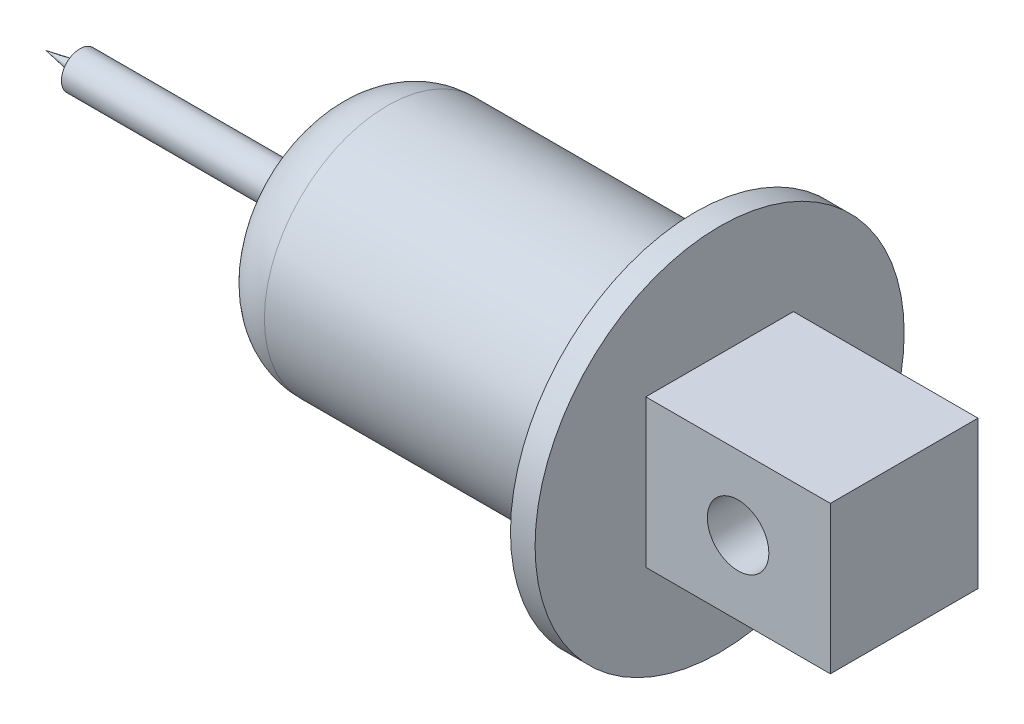
ISO-10303-21;
HEADER;
FILE_DESCRIPTION(('STEP AP214'),'2;1');
FILE_NAME('part.step','',(''),(''),'','','');
FILE_SCHEMA(('AUTOMOTIVE_DESIGN { 1 0 10303 214 1 1 1 1 }'));
ENDSEC;
DATA;
#1=APPLICATION_CONTEXT('core data for automotive mechanical design processes');
#2=APPLICATION_PROTOCOL_DEFINITION('international standard','automotive_design',2000,#1);
#3=PRODUCT_CONTEXT('',#1,'mechanical');
#4=PRODUCT('Part','Part','',(#3));
#5=PRODUCT_RELATED_PRODUCT_CATEGORY('part','',(#4));
#6=PRODUCT_DEFINITION_FORMATION('','',#4);
#7=PRODUCT_DEFINITION_CONTEXT('part definition',#1,'design');
#8=PRODUCT_DEFINITION('design','',#6,#7);
#9=PRODUCT_DEFINITION_SHAPE('','',#8);
#10=(LENGTH_UNIT() NAMED_UNIT(*) SI_UNIT(.MILLI.,.METRE.));
#11=(NAMED_UNIT(*) PLANE_ANGLE_UNIT() SI_UNIT($,.RADIAN.));
#12=(NAMED_UNIT(*) SI_UNIT($,.STERADIAN.) SOLID_ANGLE_UNIT());
#13=UNCERTAINTY_MEASURE_WITH_UNIT(LENGTH_MEASURE(1.E-05),#10,'distance_accuracy_value','');
#14=(GEOMETRIC_REPRESENTATION_CONTEXT(3) GLOBAL_UNCERTAINTY_ASSIGNED_CONTEXT((#13)) GLOBAL_UNIT_ASSIGNED_CONTEXT((#10,
#11,#12)) REPRESENTATION_CONTEXT('',''));
#15=CARTESIAN_POINT('',(0.,0.,0.));
#16=DIRECTION('',(0.,0.,1.));
#17=DIRECTION('',(1.,0.,0.));
#18=AXIS2_PLACEMENT_3D('',#15,#16,#17);
#19=CARTESIAN_POINT('',(0.,0.,0.));
#20=DIRECTION('',(-1.,0.,0.));
#21=DIRECTION('',(0.,0.,1.));
#22=AXIS2_PLACEMENT_3D('',#19,#20,#21);
#23=PLANE('',#22);
#24=CARTESIAN_POINT('',(0.,0.,0.));
#25=DIRECTION('',(-1.,0.,0.));
#26=DIRECTION('',(0.,0.,1.));
#27=AXIS2_PLACEMENT_3D('',#24,#25,#26);
#28=CIRCLE('',#27,1.5);
#29=CARTESIAN_POINT('',(0.,0.,1.5));
#30=VERTEX_POINT('',#29);
#31=EDGE_CURVE('E262',#30,#30,#28,.T.);
#32=ORIENTED_EDGE('',*,*,#31,.T.);
#33=EDGE_LOOP('',(#32));
#34=FACE_BOUND('',#33,.T.);
#35=CARTESIAN_POINT('',(0.,0.,0.));
#36=DIRECTION('',(-1.,0.,0.));
#37=DIRECTION('',(0.,0.,1.));
#38=AXIS2_PLACEMENT_3D('',#35,#36,#37);
#39=CIRCLE('',#38,0.5);
#40=CARTESIAN_POINT('',(0.,0.,0.5));
#41=VERTEX_POINT('',#40);
#42=EDGE_CURVE('E263',#41,#41,#39,.T.);
#43=ORIENTED_EDGE('',*,*,#42,.F.);
#44=EDGE_LOOP('',(#43));
#45=FACE_BOUND('',#44,.T.);
#46=ADVANCED_FACE('F35',(#34,#45),#23,.T.);
#47=CARTESIAN_POINT('',(20.,0.,0.));
#48=DIRECTION('',(-1.,0.,0.));
#49=DIRECTION('',(0.,0.,1.));
#50=AXIS2_PLACEMENT_3D('',#47,#48,#49);
#51=PLANE('',#50);
#52=CARTESIAN_POINT('',(20.,0.,0.));
#53=DIRECTION('',(-1.,0.,0.));
#54=DIRECTION('',(0.,0.,1.));
#55=AXIS2_PLACEMENT_3D('',#52,#53,#54);
#56=CIRCLE('',#55,5.);
#57=CARTESIAN_POINT('',(20.,0.,4.99999999999993));
#58=VERTEX_POINT('',#57);
#59=EDGE_CURVE('E43',#58,#58,#56,.T.);
#60=ORIENTED_EDGE('',*,*,#59,.T.);
#61=EDGE_LOOP('',(#60));
#62=FACE_BOUND('',#61,.T.);
#63=CARTESIAN_POINT('',(20.,0.,0.));
#64=DIRECTION('',(-1.,0.,0.));
#65=DIRECTION('',(0.,0.,1.));
#66=AXIS2_PLACEMENT_3D('',#63,#64,#65);
#67=CIRCLE('',#66,1.5);
#68=CARTESIAN_POINT('',(20.,0.,1.49999999999993));
#69=VERTEX_POINT('',#68);
#70=EDGE_CURVE('E260',#69,#69,#67,.T.);
#71=ORIENTED_EDGE('',*,*,#70,.F.);
#72=EDGE_LOOP('',(#71));
#73=FACE_BOUND('',#72,.T.);
#74=ADVANCED_FACE('F97',(#62,#73),#51,.T.);
#75=CARTESIAN_POINT('',(50.,0.,-1.74574066942157E-13));
#76=DIRECTION('',(1.,0.,0.));
#77=DIRECTION('',(0.,0.,-1.));
#78=AXIS2_PLACEMENT_3D('',#75,#76,#77);
#79=PLANE('',#78);
#80=CARTESIAN_POINT('',(50.,0.,-1.74574066942157E-13));
#81=DIRECTION('',(1.,0.,0.));
#82=DIRECTION('',(0.,0.,-1.));
#83=AXIS2_PLACEMENT_3D('',#80,#81,#82);
#84=CIRCLE('',#83,15.);
#85=CARTESIAN_POINT('',(50.,0.,-15.0000000000002));
#86=VERTEX_POINT('',#85);
#87=EDGE_CURVE('E147',#86,#86,#84,.T.);
#88=ORIENTED_EDGE('',*,*,#87,.F.);
#89=EDGE_LOOP('',(#88));
#90=FACE_BOUND('',#89,.T.);
#91=CARTESIAN_POINT('',(50.,0.,-1.74574066942157E-13));
#92=DIRECTION('',(1.,0.,0.));
#93=DIRECTION('',(0.,0.,-1.));
#94=AXIS2_PLACEMENT_3D('',#91,#92,#93);
#95=CIRCLE('',#94,10.);
#96=CARTESIAN_POINT('',(50.,0.,-10.0000000000002));
#97=VERTEX_POINT('',#96);
#98=EDGE_CURVE('E153',#97,#97,#95,.F.);
#99=ORIENTED_EDGE('',*,*,#98,.F.);
#100=EDGE_LOOP('',(#99));
#101=FACE_BOUND('',#100,.T.);
#102=ADVANCED_FACE('F102',(#90,#101),#79,.F.);
#103=CARTESIAN_POINT('',(52.,0.,-1.81557029619843E-13));
#104=DIRECTION('',(1.,0.,0.));
#105=DIRECTION('',(0.,0.,-1.));
#106=AXIS2_PLACEMENT_3D('',#103,#104,#105);
#107=PLANE('',#106);
#108=CARTESIAN_POINT('',(52.,0.,-1.81557029619843E-13));
#109=DIRECTION('',(1.,0.,0.));
#110=DIRECTION('',(0.,0.,-1.));
#111=AXIS2_PLACEMENT_3D('',#108,#109,#110);
#112=CIRCLE('',#111,15.);
#113=CARTESIAN_POINT('',(52.,0.,-15.0000000000002));
#114=VERTEX_POINT('',#113);
#115=EDGE_CURVE('E150',#114,#114,#112,.T.);
#116=ORIENTED_EDGE('',*,*,#115,.T.);
#117=EDGE_LOOP('',(#116));
#118=FACE_BOUND('',#117,.T.);
#119=DIRECTION('',(0.,0.,1.));
#120=VECTOR('',#119,1.);
#121=CARTESIAN_POINT('',(52.,6.,5.99999999999982));
#122=LINE('',#121,#120);
#123=CARTESIAN_POINT('',(52.,6.,-6.00000000000018));
#124=VERTEX_POINT('',#123);
#125=CARTESIAN_POINT('',(52.,6.,5.99999999999982));
#126=VERTEX_POINT('',#125);
#127=EDGE_CURVE('E279',#124,#126,#122,.T.);
#128=ORIENTED_EDGE('',*,*,#127,.F.);
#129=DIRECTION('',(0.,1.,0.));
#130=VECTOR('',#129,1.);
#131=CARTESIAN_POINT('',(52.,6.,-6.00000000000018));
#132=LINE('',#131,#130);
#133=CARTESIAN_POINT('',(52.,-6.,-6.00000000000018));
#134=VERTEX_POINT('',#133);
#135=EDGE_CURVE('E161',#134,#124,#132,.T.);
#136=ORIENTED_EDGE('',*,*,#135,.F.);
#137=DIRECTION('',(0.,0.,-1.));
#138=VECTOR('',#137,1.);
#139=CARTESIAN_POINT('',(52.,-6.,5.99999999999982));
#140=LINE('',#139,#138);
#141=CARTESIAN_POINT('',(52.,-6.,5.99999999999982));
#142=VERTEX_POINT('',#141);
#143=EDGE_CURVE('E73',#142,#134,#140,.T.);
#144=ORIENTED_EDGE('',*,*,#143,.F.);
#145=DIRECTION('',(0.,-1.,0.));
#146=VECTOR('',#145,1.);
#147=CARTESIAN_POINT('',(52.,6.,5.99999999999982));
#148=LINE('',#147,#146);
#149=EDGE_CURVE('E281',#126,#142,#148,.T.);
#150=ORIENTED_EDGE('',*,*,#149,.F.);
#151=EDGE_LOOP('',(#128,#136,#144,#150));
#152=FACE_BOUND('',#151,.T.);
#153=ADVANCED_FACE('F136',(#118,#152),#107,.T.);
#154=CARTESIAN_POINT('',(50.,0.,-1.74574066942157E-13));
#155=DIRECTION('',(1.,0.,0.));
#156=DIRECTION('',(0.,0.,-1.));
#157=AXIS2_PLACEMENT_3D('',#154,#155,#156);
#158=CYLINDRICAL_SURFACE('',#157,15.);
#159=ORIENTED_EDGE('',*,*,#87,.T.);
#160=EDGE_LOOP('',(#159));
#161=FACE_BOUND('',#160,.T.);
#162=ORIENTED_EDGE('',*,*,#115,.F.);
#163=EDGE_LOOP('',(#162));
#164=FACE_BOUND('',#163,.T.);
#165=ADVANCED_FACE('F132',(#161,#164),#158,.T.);
#166=CARTESIAN_POINT('',(67.,6.,-6.00000000000023));
#167=DIRECTION('',(0.,0.,1.));
#168=DIRECTION('',(0.,-1.,0.));
#169=AXIS2_PLACEMENT_3D('',#166,#167,#168);
#170=PLANE('',#169);
#171=CARTESIAN_POINT('',(59.5,0.,-6.00000000000021));
#172=DIRECTION('',(0.,0.,-1.));
#173=DIRECTION('',(0.,1.,0.));
#174=AXIS2_PLACEMENT_3D('',#171,#172,#173);
#175=CIRCLE('',#174,2.5);
#176=CARTESIAN_POINT('',(59.5,2.5,-6.00000000000021));
#177=VERTEX_POINT('',#176);
#178=EDGE_CURVE('E162',#177,#177,#175,.T.);
#179=ORIENTED_EDGE('',*,*,#178,.F.);
#180=EDGE_LOOP('',(#179));
#181=FACE_BOUND('',#180,.T.);
#182=ORIENTED_EDGE('',*,*,#135,.T.);
#183=DIRECTION('',(-1.,0.,0.));
#184=VECTOR('',#183,1.);
#185=CARTESIAN_POINT('',(67.,6.,-6.00000000000023));
#186=LINE('',#185,#184);
#187=CARTESIAN_POINT('',(67.,6.,-6.00000000000023));
#188=VERTEX_POINT('',#187);
#189=EDGE_CURVE('E151',#188,#124,#186,.T.);
#190=ORIENTED_EDGE('',*,*,#189,.F.);
#191=DIRECTION('',(0.,1.,0.));
#192=VECTOR('',#191,1.);
#193=CARTESIAN_POINT('',(67.,6.,-6.00000000000023));
#194=LINE('',#193,#192);
#195=CARTESIAN_POINT('',(67.,-6.,-6.00000000000024));
#196=VERTEX_POINT('',#195);
#197=EDGE_CURVE('E270',#196,#188,#194,.T.);
#198=ORIENTED_EDGE('',*,*,#197,.F.);
#199=DIRECTION('',(-1.,0.,0.));
#200=VECTOR('',#199,1.);
#201=CARTESIAN_POINT('',(67.,-6.,-6.00000000000024));
#202=LINE('',#201,#200);
#203=EDGE_CURVE('E276',#196,#134,#202,.T.);
#204=ORIENTED_EDGE('',*,*,#203,.T.);
#205=EDGE_LOOP('',(#182,#190,#198,#204));
#206=FACE_BOUND('',#205,.T.);
#207=ADVANCED_FACE('F129',(#181,#206),#170,.F.);
#208=CARTESIAN_POINT('',(67.,6.,5.99999999999977));
#209=DIRECTION('',(0.,-1.,0.));
#210=DIRECTION('',(-1.,0.,0.));
#211=AXIS2_PLACEMENT_3D('',#208,#209,#210);
#212=PLANE('',#211);
#213=ORIENTED_EDGE('',*,*,#127,.T.);
#214=DIRECTION('',(-1.,0.,0.));
#215=VECTOR('',#214,1.);
#216=CARTESIAN_POINT('',(67.,6.,5.99999999999977));
#217=LINE('',#216,#215);
#218=CARTESIAN_POINT('',(67.,6.,5.99999999999977));
#219=VERTEX_POINT('',#218);
#220=EDGE_CURVE('E155',#219,#126,#217,.T.);
#221=ORIENTED_EDGE('',*,*,#220,.F.);
#222=DIRECTION('',(0.,0.,1.));
#223=VECTOR('',#222,1.);
#224=CARTESIAN_POINT('',(67.,6.,5.99999999999977));
#225=LINE('',#224,#223);
#226=EDGE_CURVE('E80',#188,#219,#225,.T.);
#227=ORIENTED_EDGE('',*,*,#226,.F.);
#228=ORIENTED_EDGE('',*,*,#189,.T.);
#229=EDGE_LOOP('',(#213,#221,#227,#228));
#230=FACE_BOUND('',#229,.T.);
#231=ADVANCED_FACE('F125',(#230),#212,.F.);
#232=CARTESIAN_POINT('',(67.,6.,5.99999999999977));
#233=DIRECTION('',(0.,0.,-1.));
#234=DIRECTION('',(0.,1.,0.));
#235=AXIS2_PLACEMENT_3D('',#232,#233,#234);
#236=PLANE('',#235);
#237=CARTESIAN_POINT('',(59.5,0.,5.99999999999979));
#238=DIRECTION('',(0.,0.,-1.));
#239=DIRECTION('',(0.,1.,0.));
#240=AXIS2_PLACEMENT_3D('',#237,#238,#239);
#241=CIRCLE('',#240,2.5);
#242=CARTESIAN_POINT('',(59.5,2.5,5.99999999999979));
#243=VERTEX_POINT('',#242);
#244=EDGE_CURVE('E158',#243,#243,#241,.T.);
#245=ORIENTED_EDGE('',*,*,#244,.T.);
#246=EDGE_LOOP('',(#245));
#247=FACE_BOUND('',#246,.T.);
#248=ORIENTED_EDGE('',*,*,#149,.T.);
#249=DIRECTION('',(-1.,0.,0.));
#250=VECTOR('',#249,1.);
#251=CARTESIAN_POINT('',(67.,-6.,5.99999999999976));
#252=LINE('',#251,#250);
#253=CARTESIAN_POINT('',(67.,-6.,5.99999999999976));
#254=VERTEX_POINT('',#253);
#255=EDGE_CURVE('E50',#254,#142,#252,.T.);
#256=ORIENTED_EDGE('',*,*,#255,.F.);
#257=DIRECTION('',(0.,-1.,0.));
#258=VECTOR('',#257,1.);
#259=CARTESIAN_POINT('',(67.,6.,5.99999999999977));
#260=LINE('',#259,#258);
#261=EDGE_CURVE('E273',#219,#254,#260,.T.);
#262=ORIENTED_EDGE('',*,*,#261,.F.);
#263=ORIENTED_EDGE('',*,*,#220,.T.);
#264=EDGE_LOOP('',(#248,#256,#262,#263));
#265=FACE_BOUND('',#264,.T.);
#266=ADVANCED_FACE('F122',(#247,#265),#236,.F.);
#267=CARTESIAN_POINT('',(67.,-6.,5.99999999999976));
#268=DIRECTION('',(0.,1.,0.));
#269=DIRECTION('',(1.,0.,0.));
#270=AXIS2_PLACEMENT_3D('',#267,#268,#269);
#271=PLANE('',#270);
#272=ORIENTED_EDGE('',*,*,#143,.T.);
#273=ORIENTED_EDGE('',*,*,#203,.F.);
#274=DIRECTION('',(0.,0.,-1.));
#275=VECTOR('',#274,1.);
#276=CARTESIAN_POINT('',(67.,-6.,5.99999999999976));
#277=LINE('',#276,#275);
#278=EDGE_CURVE('E58',#254,#196,#277,.T.);
#279=ORIENTED_EDGE('',*,*,#278,.F.);
#280=ORIENTED_EDGE('',*,*,#255,.T.);
#281=EDGE_LOOP('',(#272,#273,#279,#280));
#282=FACE_BOUND('',#281,.T.);
#283=ADVANCED_FACE('F119',(#282),#271,.F.);
#284=CARTESIAN_POINT('',(67.,0.,-2.3392924970249E-13));
#285=DIRECTION('',(1.,0.,0.));
#286=DIRECTION('',(0.,0.,-1.));
#287=AXIS2_PLACEMENT_3D('',#284,#285,#286);
#288=PLANE('',#287);
#289=ORIENTED_EDGE('',*,*,#197,.T.);
#290=ORIENTED_EDGE('',*,*,#226,.T.);
#291=ORIENTED_EDGE('',*,*,#261,.T.);
#292=ORIENTED_EDGE('',*,*,#278,.T.);
#293=EDGE_LOOP('',(#289,#290,#291,#292));
#294=FACE_BOUND('',#293,.T.);
#295=ADVANCED_FACE('F115',(#294),#288,.T.);
#296=CARTESIAN_POINT('',(59.5000000000001,0.,14.9999999999998));
#297=DIRECTION('',(0.,0.,-1.));
#298=DIRECTION('',(0.,1.,0.));
#299=AXIS2_PLACEMENT_3D('',#296,#297,#298);
#300=CYLINDRICAL_SURFACE('',#299,2.5);
#301=CARTESIAN_POINT('',(59.5,2.5,-6.00000000000021));
#302=CARTESIAN_POINT('',(59.5,2.5,-5.87500000000021));
#303=CARTESIAN_POINT('',(59.5,2.5,-5.75000000000021));
#304=CARTESIAN_POINT('',(59.5,2.5,-5.50000000000021));
#305=CARTESIAN_POINT('',(59.5,2.5,-5.37500000000021));
#306=CARTESIAN_POINT('',(59.5,2.5,-5.12500000000021));
#307=CARTESIAN_POINT('',(59.5,2.5,-5.00000000000021));
#308=CARTESIAN_POINT('',(59.5,2.5,-4.75000000000021));
#309=CARTESIAN_POINT('',(59.5,2.5,-4.62500000000021));
#310=CARTESIAN_POINT('',(59.5,2.5,-4.37500000000021));
#311=CARTESIAN_POINT('',(59.5,2.5,-4.25000000000021));
#312=CARTESIAN_POINT('',(59.5,2.5,-4.00000000000021));
#313=CARTESIAN_POINT('',(59.5,2.5,-3.87500000000021));
#314=CARTESIAN_POINT('',(59.5,2.5,-3.62500000000021));
#315=CARTESIAN_POINT('',(59.5,2.5,-3.50000000000021));
#316=CARTESIAN_POINT('',(59.5,2.5,-3.25000000000021));
#317=CARTESIAN_POINT('',(59.5,2.5,-3.12500000000021));
#318=CARTESIAN_POINT('',(59.5,2.5,-2.87500000000021));
#319=CARTESIAN_POINT('',(59.5,2.5,-2.75000000000021));
#320=CARTESIAN_POINT('',(59.5,2.5,-2.50000000000021));
#321=CARTESIAN_POINT('',(59.5,2.5,-2.37500000000021));
#322=CARTESIAN_POINT('',(59.5,2.5,-2.12500000000021));
#323=CARTESIAN_POINT('',(59.5,2.5,-2.00000000000021));
#324=CARTESIAN_POINT('',(59.5,2.5,-1.75000000000021));
#325=CARTESIAN_POINT('',(59.5,2.5,-1.62500000000021));
#326=CARTESIAN_POINT('',(59.5,2.5,-1.37500000000021));
#327=CARTESIAN_POINT('',(59.5,2.5,-1.25000000000021));
#328=CARTESIAN_POINT('',(59.5,2.5,-1.00000000000021));
#329=CARTESIAN_POINT('',(59.5,2.5,-0.875000000000207));
#330=CARTESIAN_POINT('',(59.5,2.5,-0.625000000000208));
#331=CARTESIAN_POINT('',(59.5,2.5,-0.500000000000209));
#332=CARTESIAN_POINT('',(59.5,2.5,-0.25000000000021));
#333=CARTESIAN_POINT('',(59.5,2.5,-0.12500000000021));
#334=CARTESIAN_POINT('',(59.5,2.5,0.12499999999979));
#335=CARTESIAN_POINT('',(59.5,2.5,0.24999999999979));
#336=CARTESIAN_POINT('',(59.5,2.5,0.49999999999979));
#337=CARTESIAN_POINT('',(59.5,2.5,0.62499999999979));
#338=CARTESIAN_POINT('',(59.5,2.5,0.874999999999789));
#339=CARTESIAN_POINT('',(59.5,2.5,0.999999999999789));
#340=CARTESIAN_POINT('',(59.5,2.5,1.24999999999979));
#341=CARTESIAN_POINT('',(59.5,2.5,1.37499999999979));
#342=CARTESIAN_POINT('',(59.5,2.5,1.62499999999979));
#343=CARTESIAN_POINT('',(59.5,2.5,1.74999999999979));
#344=CARTESIAN_POINT('',(59.5,2.5,1.99999999999979));
#345=CARTESIAN_POINT('',(59.5,2.5,2.12499999999979));
#346=CARTESIAN_POINT('',(59.5,2.5,2.37499999999979));
#347=CARTESIAN_POINT('',(59.5,2.5,2.49999999999979));
#348=CARTESIAN_POINT('',(59.5,2.5,2.74999999999979));
#349=CARTESIAN_POINT('',(59.5,2.5,2.87499999999979));
#350=CARTESIAN_POINT('',(59.5,2.5,3.12499999999979));
#351=CARTESIAN_POINT('',(59.5,2.5,3.24999999999979));
#352=CARTESIAN_POINT('',(59.5,2.5,3.49999999999979));
#353=CARTESIAN_POINT('',(59.5,2.5,3.62499999999979));
#354=CARTESIAN_POINT('',(59.5,2.5,3.87499999999979));
#355=CARTESIAN_POINT('',(59.5,2.5,3.99999999999979));
#356=CARTESIAN_POINT('',(59.5,2.5,4.24999999999979));
#357=CARTESIAN_POINT('',(59.5,2.5,4.37499999999979));
#358=CARTESIAN_POINT('',(59.5,2.5,4.62499999999979));
#359=CARTESIAN_POINT('',(59.5,2.5,4.74999999999979));
#360=CARTESIAN_POINT('',(59.5,2.5,4.99999999999979));
#361=CARTESIAN_POINT('',(59.5,2.5,5.12499999999979));
#362=CARTESIAN_POINT('',(59.5,2.5,5.37499999999979));
#363=CARTESIAN_POINT('',(59.5,2.5,5.49999999999979));
#364=CARTESIAN_POINT('',(59.5,2.5,5.74999999999979));
#365=CARTESIAN_POINT('',(59.5,2.5,5.87499999999979));
#366=CARTESIAN_POINT('',(59.5,2.5,5.99999999999979));
#367=B_SPLINE_CURVE_WITH_KNOTS('',3,(#301,#302,#303,#304,#305,#306,#307,#308,#309,#310,#311,
#312,#313,#314,#315,#316,#317,#318,#319,#320,#321,#322,#323,#324,#325,#326,#327,#328,#329,#330,
#331,#332,#333,#334,#335,#336,#337,#338,#339,#340,#341,#342,#343,#344,#345,#346,#347,#348,#349,
#350,#351,#352,#353,#354,#355,#356,#357,#358,#359,#360,#361,#362,#363,#364,#365,#366),
.UNSPECIFIED.,.F.,.F.,(4,2,2,2,2,2,2,2,2,2,2,2,2,2,2,2,2,2,2,2,2,2,2,2,2,2,2,2,2,2,2,2,4),(0.,
0.375,0.750000000000001,1.125,1.5,1.875,2.25,2.625,3.,3.375,3.75,4.125,4.5,4.875,5.25,5.625,6.,
6.375,6.75,7.125,7.5,7.875,8.25,8.625,9.,9.375,9.75,10.125,10.5,10.875,11.25,11.625,12.),.UNSPECIFIED.);
#368=EDGE_CURVE('BSEAM111',#177,#243,#367,.T.);
#369=ORIENTED_EDGE('',*,*,#178,.T.);
#370=ORIENTED_EDGE('',*,*,#244,.F.);
#371=ORIENTED_EDGE('',*,*,#368,.T.);
#372=ORIENTED_EDGE('',*,*,#368,.F.);
#373=EDGE_LOOP('',(#369,#371,#370,#372));
#374=FACE_BOUND('',#373,.T.);
#375=ADVANCED_FACE('F111',(#374),#300,.F.);
#376=CARTESIAN_POINT('',(20.,0.,0.));
#377=DIRECTION('',(1.,0.,0.));
#378=DIRECTION('',(0.,0.,-1.));
#379=AXIS2_PLACEMENT_3D('',#376,#377,#378);
#380=CYLINDRICAL_SURFACE('',#379,10.);
#381=CARTESIAN_POINT('',(25.,0.,0.));
#382=DIRECTION('',(-1.,0.,0.));
#383=DIRECTION('',(0.,0.,1.));
#384=AXIS2_PLACEMENT_3D('',#381,#382,#383);
#385=CIRCLE('',#384,10.);
#386=CARTESIAN_POINT('',(25.,0.,9.99999999999991));
#387=VERTEX_POINT('',#386);
#388=EDGE_CURVE('E12',#387,#387,#385,.F.);
#389=ORIENTED_EDGE('',*,*,#388,.T.);
#390=EDGE_LOOP('',(#389));
#391=FACE_BOUND('',#390,.T.);
#392=ORIENTED_EDGE('',*,*,#98,.T.);
#393=EDGE_LOOP('',(#392));
#394=FACE_BOUND('',#393,.T.);
#395=ADVANCED_FACE('F108',(#391,#394),#380,.T.);
#396=CARTESIAN_POINT('',(25.,0.,0.));
#397=DIRECTION('',(-1.,0.,0.));
#398=DIRECTION('',(0.,0.,1.));
#399=AXIS2_PLACEMENT_3D('',#396,#397,#398);
#400=DEGENERATE_TOROIDAL_SURFACE('',#399,5.,5.,.T.);
#401=ORIENTED_EDGE('',*,*,#388,.F.);
#402=EDGE_LOOP('',(#401));
#403=FACE_BOUND('',#402,.T.);
#404=ORIENTED_EDGE('',*,*,#59,.F.);
#405=EDGE_LOOP('',(#404));
#406=FACE_BOUND('',#405,.T.);
#407=ADVANCED_FACE('F37',(#403,#406),#400,.T.);
#408=CARTESIAN_POINT('',(0.,0.,0.));
#409=DIRECTION('',(1.,0.,0.));
#410=DIRECTION('',(0.,0.,-1.));
#411=AXIS2_PLACEMENT_3D('',#408,#409,#410);
#412=CYLINDRICAL_SURFACE('',#411,1.5);
#413=ORIENTED_EDGE('',*,*,#31,.F.);
#414=EDGE_LOOP('',(#413));
#415=FACE_BOUND('',#414,.T.);
#416=ORIENTED_EDGE('',*,*,#70,.T.);
#417=EDGE_LOOP('',(#416));
#418=FACE_BOUND('',#417,.T.);
#419=ADVANCED_FACE('F86',(#415,#418),#412,.T.);
#420=CARTESIAN_POINT('',(-2.75,0.,0.));
#421=DIRECTION('',(1.,0.,0.));
#422=DIRECTION('',(0.,0.,-1.));
#423=AXIS2_PLACEMENT_3D('',#420,#421,#422);
#424=CONICAL_SURFACE('',#423,0.,0.179853499792478);
#425=ORIENTED_EDGE('',*,*,#42,.T.);
#426=EDGE_LOOP('',(#425));
#427=FACE_BOUND('',#426,.T.);
#428=CARTESIAN_POINT('',(-2.75,0.,0.));
#429=VERTEX_POINT('',#428);
#430=VERTEX_LOOP('',#429);
#431=FACE_BOUND('',#430,.T.);
#432=ADVANCED_FACE('F84',(#427,#431),#424,.T.);
#433=CLOSED_SHELL('',(#46,#74,#102,#153,#165,#207,#231,#266,#283,#295,#375,#395,#407,#419,#432));
#434=MANIFOLD_SOLID_BREP('B2',#433);
#435=ADVANCED_BREP_SHAPE_REPRESENTATION('',(#18,#434),#14);
#436=SHAPE_DEFINITION_REPRESENTATION(#9,#435);
ENDSEC;
END-ISO-10303-21;
